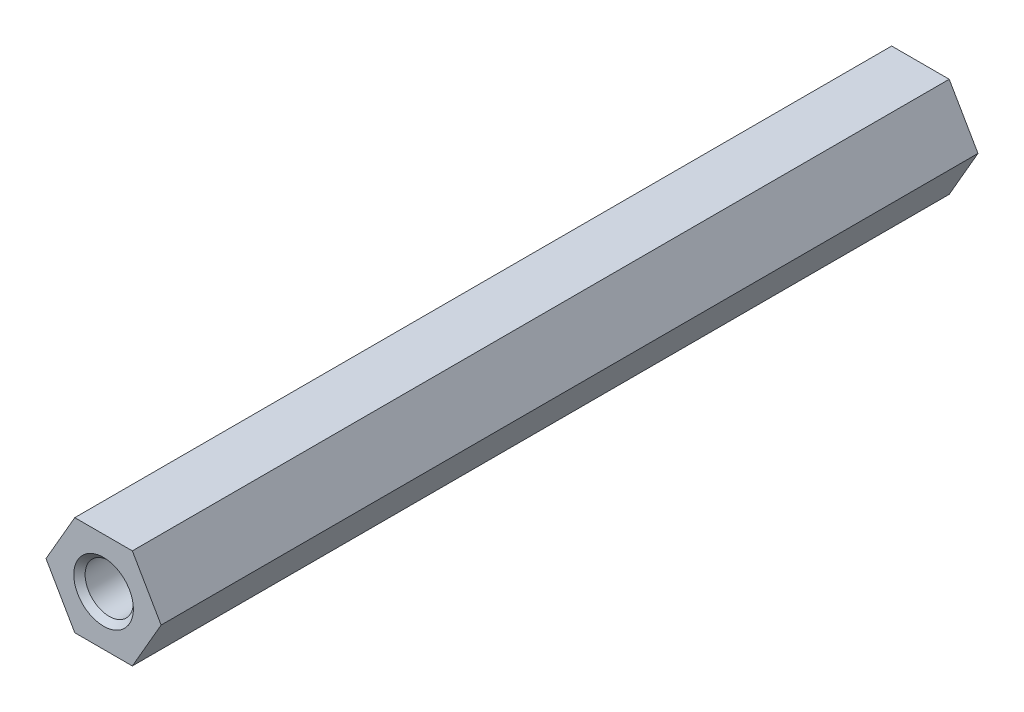
ISO-10303-21;
HEADER;
FILE_DESCRIPTION(('STEP AP214'),'2;1');
FILE_NAME('part.step','',(''),(''),'','','');
FILE_SCHEMA(('AUTOMOTIVE_DESIGN { 1 0 10303 214 1 1 1 1 }'));
ENDSEC;
DATA;
#1=APPLICATION_CONTEXT('core data for automotive mechanical design processes');
#2=APPLICATION_PROTOCOL_DEFINITION('international standard','automotive_design',2000,#1);
#3=PRODUCT_CONTEXT('',#1,'mechanical');
#4=PRODUCT('Part','Part','',(#3));
#5=PRODUCT_RELATED_PRODUCT_CATEGORY('part','',(#4));
#6=PRODUCT_DEFINITION_FORMATION('','',#4);
#7=PRODUCT_DEFINITION_CONTEXT('part definition',#1,'design');
#8=PRODUCT_DEFINITION('design','',#6,#7);
#9=PRODUCT_DEFINITION_SHAPE('','',#8);
#10=(LENGTH_UNIT() NAMED_UNIT(*) SI_UNIT(.MILLI.,.METRE.));
#11=(NAMED_UNIT(*) PLANE_ANGLE_UNIT() SI_UNIT($,.RADIAN.));
#12=(NAMED_UNIT(*) SI_UNIT($,.STERADIAN.) SOLID_ANGLE_UNIT());
#13=UNCERTAINTY_MEASURE_WITH_UNIT(LENGTH_MEASURE(1.E-05),#10,'distance_accuracy_value','');
#14=(GEOMETRIC_REPRESENTATION_CONTEXT(3) GLOBAL_UNCERTAINTY_ASSIGNED_CONTEXT((#13)) GLOBAL_UNIT_ASSIGNED_CONTEXT((#10,
#11,#12)) REPRESENTATION_CONTEXT('',''));
#15=CARTESIAN_POINT('',(0.,0.,0.));
#16=DIRECTION('',(0.,0.,1.));
#17=DIRECTION('',(1.,0.,0.));
#18=AXIS2_PLACEMENT_3D('',#15,#16,#17);
#19=CARTESIAN_POINT('',(1.78978583448784,-3.1,-50.8));
#20=DIRECTION('',(0.866025403784439,-0.5,0.));
#21=DIRECTION('',(0.5,0.866025403784439,0.));
#22=AXIS2_PLACEMENT_3D('',#19,#20,#21);
#23=PLANE('',#22);
#24=DIRECTION('',(0.5,0.866025403784439,0.));
#25=VECTOR('',#24,1.);
#26=CARTESIAN_POINT('',(1.78978583448784,-3.1,0.));
#27=LINE('',#26,#25);
#28=CARTESIAN_POINT('',(1.78978583448784,-3.1,0.));
#29=VERTEX_POINT('',#28);
#30=CARTESIAN_POINT('',(3.57957166897568,0.,0.));
#31=VERTEX_POINT('',#30);
#32=EDGE_CURVE('E125',#29,#31,#27,.T.);
#33=ORIENTED_EDGE('',*,*,#32,.F.);
#34=DIRECTION('',(0.,0.,1.));
#35=VECTOR('',#34,1.);
#36=CARTESIAN_POINT('',(1.78978583448784,-3.1,-50.8));
#37=LINE('',#36,#35);
#38=CARTESIAN_POINT('',(1.78978583448784,-3.1,-50.8));
#39=VERTEX_POINT('',#38);
#40=EDGE_CURVE('E54',#39,#29,#37,.T.);
#41=ORIENTED_EDGE('',*,*,#40,.F.);
#42=DIRECTION('',(0.5,0.866025403784439,0.));
#43=VECTOR('',#42,1.);
#44=CARTESIAN_POINT('',(1.78978583448784,-3.1,-50.8));
#45=LINE('',#44,#43);
#46=CARTESIAN_POINT('',(3.57957166897568,0.,-50.8));
#47=VERTEX_POINT('',#46);
#48=EDGE_CURVE('E141',#39,#47,#45,.T.);
#49=ORIENTED_EDGE('',*,*,#48,.T.);
#50=DIRECTION('',(0.,0.,1.));
#51=VECTOR('',#50,1.);
#52=CARTESIAN_POINT('',(3.57957166897568,0.,-50.8));
#53=LINE('',#52,#51);
#54=EDGE_CURVE('E89',#47,#31,#53,.T.);
#55=ORIENTED_EDGE('',*,*,#54,.T.);
#56=EDGE_LOOP('',(#33,#41,#49,#55));
#57=FACE_BOUND('',#56,.T.);
#58=ADVANCED_FACE('F32',(#57),#23,.T.);
#59=CARTESIAN_POINT('',(-1.78978583448784,-3.1,-50.8));
#60=DIRECTION('',(0.,-1.,0.));
#61=DIRECTION('',(0.,0.,-1.));
#62=AXIS2_PLACEMENT_3D('',#59,#60,#61);
#63=PLANE('',#62);
#64=DIRECTION('',(1.,0.,0.));
#65=VECTOR('',#64,1.);
#66=CARTESIAN_POINT('',(-1.78978583448784,-3.1,0.));
#67=LINE('',#66,#65);
#68=CARTESIAN_POINT('',(-1.78978583448784,-3.1,0.));
#69=VERTEX_POINT('',#68);
#70=EDGE_CURVE('E138',#69,#29,#67,.T.);
#71=ORIENTED_EDGE('',*,*,#70,.F.);
#72=DIRECTION('',(0.,0.,1.));
#73=VECTOR('',#72,1.);
#74=CARTESIAN_POINT('',(-1.78978583448784,-3.1,-50.8));
#75=LINE('',#74,#73);
#76=CARTESIAN_POINT('',(-1.78978583448784,-3.1,-50.8));
#77=VERTEX_POINT('',#76);
#78=EDGE_CURVE('E77',#77,#69,#75,.T.);
#79=ORIENTED_EDGE('',*,*,#78,.F.);
#80=DIRECTION('',(1.,0.,0.));
#81=VECTOR('',#80,1.);
#82=CARTESIAN_POINT('',(-1.78978583448784,-3.1,-50.8));
#83=LINE('',#82,#81);
#84=EDGE_CURVE('E115',#77,#39,#83,.T.);
#85=ORIENTED_EDGE('',*,*,#84,.T.);
#86=ORIENTED_EDGE('',*,*,#40,.T.);
#87=EDGE_LOOP('',(#71,#79,#85,#86));
#88=FACE_BOUND('',#87,.T.);
#89=ADVANCED_FACE('F168',(#88),#63,.T.);
#90=CARTESIAN_POINT('',(-3.57957166897568,0.,-50.8));
#91=DIRECTION('',(-0.866025403784438,-0.5,0.));
#92=DIRECTION('',(0.5,-0.866025403784439,0.));
#93=AXIS2_PLACEMENT_3D('',#90,#91,#92);
#94=PLANE('',#93);
#95=DIRECTION('',(0.5,-0.866025403784438,0.));
#96=VECTOR('',#95,1.);
#97=CARTESIAN_POINT('',(-3.57957166897568,0.,0.));
#98=LINE('',#97,#96);
#99=CARTESIAN_POINT('',(-3.57957166897568,0.,0.));
#100=VERTEX_POINT('',#99);
#101=EDGE_CURVE('E102',#100,#69,#98,.T.);
#102=ORIENTED_EDGE('',*,*,#101,.F.);
#103=DIRECTION('',(0.,0.,1.));
#104=VECTOR('',#103,1.);
#105=CARTESIAN_POINT('',(-3.57957166897568,0.,-50.8));
#106=LINE('',#105,#104);
#107=CARTESIAN_POINT('',(-3.57957166897568,0.,-50.8));
#108=VERTEX_POINT('',#107);
#109=EDGE_CURVE('E97',#108,#100,#106,.T.);
#110=ORIENTED_EDGE('',*,*,#109,.F.);
#111=DIRECTION('',(0.5,-0.866025403784438,0.));
#112=VECTOR('',#111,1.);
#113=CARTESIAN_POINT('',(-3.57957166897568,0.,-50.8));
#114=LINE('',#113,#112);
#115=EDGE_CURVE('E100',#108,#77,#114,.T.);
#116=ORIENTED_EDGE('',*,*,#115,.T.);
#117=ORIENTED_EDGE('',*,*,#78,.T.);
#118=EDGE_LOOP('',(#102,#110,#116,#117));
#119=FACE_BOUND('',#118,.T.);
#120=ADVANCED_FACE('F99',(#119),#94,.T.);
#121=CARTESIAN_POINT('',(-1.78978583448784,3.1,-50.8));
#122=DIRECTION('',(-0.866025403784439,0.5,0.));
#123=DIRECTION('',(-0.5,-0.866025403784439,0.));
#124=AXIS2_PLACEMENT_3D('',#121,#122,#123);
#125=PLANE('',#124);
#126=DIRECTION('',(-0.5,-0.866025403784439,0.));
#127=VECTOR('',#126,1.);
#128=CARTESIAN_POINT('',(-1.78978583448784,3.1,0.));
#129=LINE('',#128,#127);
#130=CARTESIAN_POINT('',(-1.78978583448784,3.1,0.));
#131=VERTEX_POINT('',#130);
#132=EDGE_CURVE('E135',#131,#100,#129,.T.);
#133=ORIENTED_EDGE('',*,*,#132,.F.);
#134=DIRECTION('',(0.,0.,1.));
#135=VECTOR('',#134,1.);
#136=CARTESIAN_POINT('',(-1.78978583448784,3.1,-50.8));
#137=LINE('',#136,#135);
#138=CARTESIAN_POINT('',(-1.78978583448784,3.1,-50.8));
#139=VERTEX_POINT('',#138);
#140=EDGE_CURVE('E107',#139,#131,#137,.T.);
#141=ORIENTED_EDGE('',*,*,#140,.F.);
#142=DIRECTION('',(-0.5,-0.866025403784439,0.));
#143=VECTOR('',#142,1.);
#144=CARTESIAN_POINT('',(-1.78978583448784,3.1,-50.8));
#145=LINE('',#144,#143);
#146=EDGE_CURVE('E113',#139,#108,#145,.T.);
#147=ORIENTED_EDGE('',*,*,#146,.T.);
#148=ORIENTED_EDGE('',*,*,#109,.T.);
#149=EDGE_LOOP('',(#133,#141,#147,#148));
#150=FACE_BOUND('',#149,.T.);
#151=ADVANCED_FACE('F117',(#150),#125,.T.);
#152=CARTESIAN_POINT('',(1.78978583448784,3.1,-50.8));
#153=DIRECTION('',(0.,1.,0.));
#154=DIRECTION('',(-1.,0.,0.));
#155=AXIS2_PLACEMENT_3D('',#152,#153,#154);
#156=PLANE('',#155);
#157=DIRECTION('',(-1.,0.,0.));
#158=VECTOR('',#157,1.);
#159=CARTESIAN_POINT('',(1.78978583448784,3.1,0.));
#160=LINE('',#159,#158);
#161=CARTESIAN_POINT('',(1.78978583448784,3.1,0.));
#162=VERTEX_POINT('',#161);
#163=EDGE_CURVE('E132',#162,#131,#160,.T.);
#164=ORIENTED_EDGE('',*,*,#163,.F.);
#165=DIRECTION('',(0.,0.,1.));
#166=VECTOR('',#165,1.);
#167=CARTESIAN_POINT('',(1.78978583448784,3.1,-50.8));
#168=LINE('',#167,#166);
#169=CARTESIAN_POINT('',(1.78978583448784,3.1,-50.8));
#170=VERTEX_POINT('',#169);
#171=EDGE_CURVE('E145',#170,#162,#168,.T.);
#172=ORIENTED_EDGE('',*,*,#171,.F.);
#173=DIRECTION('',(-1.,0.,0.));
#174=VECTOR('',#173,1.);
#175=CARTESIAN_POINT('',(1.78978583448784,3.1,-50.8));
#176=LINE('',#175,#174);
#177=EDGE_CURVE('E118',#170,#139,#176,.T.);
#178=ORIENTED_EDGE('',*,*,#177,.T.);
#179=ORIENTED_EDGE('',*,*,#140,.T.);
#180=EDGE_LOOP('',(#164,#172,#178,#179));
#181=FACE_BOUND('',#180,.T.);
#182=ADVANCED_FACE('F177',(#181),#156,.T.);
#183=CARTESIAN_POINT('',(3.57957166897568,0.,-50.8));
#184=DIRECTION('',(0.866025403784439,0.5,0.));
#185=DIRECTION('',(-0.5,0.866025403784439,0.));
#186=AXIS2_PLACEMENT_3D('',#183,#184,#185);
#187=PLANE('',#186);
#188=DIRECTION('',(-0.5,0.866025403784439,0.));
#189=VECTOR('',#188,1.);
#190=CARTESIAN_POINT('',(3.57957166897568,0.,0.));
#191=LINE('',#190,#189);
#192=EDGE_CURVE('E128',#31,#162,#191,.T.);
#193=ORIENTED_EDGE('',*,*,#192,.F.);
#194=ORIENTED_EDGE('',*,*,#54,.F.);
#195=DIRECTION('',(-0.5,0.866025403784439,0.));
#196=VECTOR('',#195,1.);
#197=CARTESIAN_POINT('',(3.57957166897568,0.,-50.8));
#198=LINE('',#197,#196);
#199=EDGE_CURVE('E120',#47,#170,#198,.T.);
#200=ORIENTED_EDGE('',*,*,#199,.T.);
#201=ORIENTED_EDGE('',*,*,#171,.T.);
#202=EDGE_LOOP('',(#193,#194,#200,#201));
#203=FACE_BOUND('',#202,.T.);
#204=ADVANCED_FACE('F174',(#203),#187,.T.);
#205=CARTESIAN_POINT('',(0.,-6.2,-50.8));
#206=DIRECTION('',(0.,0.,-1.));
#207=DIRECTION('',(-1.,0.,0.));
#208=AXIS2_PLACEMENT_3D('',#205,#206,#207);
#209=PLANE('',#208);
#210=CARTESIAN_POINT('',(0.000428254180053758,0.000741757998406947,-50.8));
#211=DIRECTION('',(0.,0.,-1.));
#212=DIRECTION('',(-1.,0.,0.));
#213=AXIS2_PLACEMENT_3D('',#210,#211,#212);
#214=CIRCLE('',#213,1.85254999999999);
#215=CARTESIAN_POINT('',(-1.85212174581994,0.000741757998406947,-50.8));
#216=VERTEX_POINT('',#215);
#217=EDGE_CURVE('E11',#216,#216,#214,.F.);
#218=ORIENTED_EDGE('',*,*,#217,.T.);
#219=EDGE_LOOP('',(#218));
#220=FACE_BOUND('',#219,.T.);
#221=ORIENTED_EDGE('',*,*,#48,.F.);
#222=ORIENTED_EDGE('',*,*,#84,.F.);
#223=ORIENTED_EDGE('',*,*,#115,.F.);
#224=ORIENTED_EDGE('',*,*,#146,.F.);
#225=ORIENTED_EDGE('',*,*,#177,.F.);
#226=ORIENTED_EDGE('',*,*,#199,.F.);
#227=EDGE_LOOP('',(#221,#222,#223,#224,#225,#226));
#228=FACE_BOUND('',#227,.T.);
#229=ADVANCED_FACE('F111',(#220,#228),#209,.T.);
#230=CARTESIAN_POINT('',(0.,-6.2,0.));
#231=DIRECTION('',(0.,0.,-1.));
#232=DIRECTION('',(-1.,0.,0.));
#233=AXIS2_PLACEMENT_3D('',#230,#231,#232);
#234=PLANE('',#233);
#235=CARTESIAN_POINT('',(0.000428254180053758,0.000741757998406947,0.));
#236=DIRECTION('',(0.,0.,-1.));
#237=DIRECTION('',(-1.,0.,0.));
#238=AXIS2_PLACEMENT_3D('',#235,#236,#237);
#239=CIRCLE('',#238,1.85254999999998);
#240=CARTESIAN_POINT('',(-1.85212174581993,0.000741757998406947,0.));
#241=VERTEX_POINT('',#240);
#242=EDGE_CURVE('E46',#241,#241,#239,.T.);
#243=ORIENTED_EDGE('',*,*,#242,.T.);
#244=EDGE_LOOP('',(#243));
#245=FACE_BOUND('',#244,.T.);
#246=ORIENTED_EDGE('',*,*,#32,.T.);
#247=ORIENTED_EDGE('',*,*,#192,.T.);
#248=ORIENTED_EDGE('',*,*,#163,.T.);
#249=ORIENTED_EDGE('',*,*,#132,.T.);
#250=ORIENTED_EDGE('',*,*,#101,.T.);
#251=ORIENTED_EDGE('',*,*,#70,.T.);
#252=EDGE_LOOP('',(#246,#247,#248,#249,#250,#251));
#253=FACE_BOUND('',#252,.T.);
#254=ADVANCED_FACE('F151',(#245,#253),#234,.F.);
#255=CARTESIAN_POINT('',(0.000428254180053758,0.000741757998406947,-0.499999999999989));
#256=DIRECTION('',(0.,0.,1.));
#257=DIRECTION('',(1.,0.,0.));
#258=AXIS2_PLACEMENT_3D('',#255,#256,#257);
#259=CONICAL_SURFACE('',#258,1.35254999999999,0.78539816339745);
#260=CARTESIAN_POINT('',(-1.13887388692376,-0.976199913219537,-0.351742085431551));
#261=CARTESIAN_POINT('',(-1.09050740140774,-1.03262422726677,-0.351727999669262));
#262=CARTESIAN_POINT('',(-1.03792822463204,-1.0854607292848,-0.351716889317182));
#263=CARTESIAN_POINT('',(-0.925496150422692,-1.18279074114641,-0.351700867690997));
#264=CARTESIAN_POINT('',(-0.865637840334296,-1.22727797931283,-0.351695961061167));
#265=CARTESIAN_POINT('',(-0.73156878000186,-1.31221566223573,-0.351692238157879));
#266=CARTESIAN_POINT('',(-0.656508760453995,-1.35133460901226,-0.351694322265547));
#267=CARTESIAN_POINT('',(-0.500879254625431,-1.41641772536883,-0.351706564036563));
#268=CARTESIAN_POINT('',(-0.420308546692796,-1.44237896724928,-0.351716723495455));
#269=CARTESIAN_POINT('',(-0.255956494491913,-1.48040491021355,-0.351744827086582));
#270=CARTESIAN_POINT('',(-0.172175426279043,-1.49247080338486,-0.351762770550843));
#271=CARTESIAN_POINT('',(-0.00378173055184395,-1.50236459758979,-0.351805932855938));
#272=CARTESIAN_POINT('',(0.0808308545064723,-1.50019322182451,-0.351831151327166));
#273=CARTESIAN_POINT('',(0.248492519458984,-1.48167634530228,-0.351888149663282));
#274=CARTESIAN_POINT('',(0.331541567071425,-1.4653305522188,-0.351919929663481));
#275=CARTESIAN_POINT('',(0.493717441644787,-1.41892802990144,-0.351989150145478));
#276=CARTESIAN_POINT('',(0.572844230465483,-1.38887116736948,-0.352026590682304));
#277=CARTESIAN_POINT('',(0.724928268785867,-1.31589990246012,-0.352106070152555));
#278=CARTESIAN_POINT('',(0.797885543430412,-1.27298555248874,-0.352148109067237));
#279=CARTESIAN_POINT('',(0.935559768895114,-1.17551753086171,-0.352235593011925));
#280=CARTESIAN_POINT('',(1.00027673016371,-1.12096387396452,-0.352281038037613));
#281=CARTESIAN_POINT('',(1.11963336895297,-1.00176577713641,-0.352374044992566));
#282=CARTESIAN_POINT('',(1.17427303828985,-0.937121329010814,-0.352421606923549));
#283=CARTESIAN_POINT('',(1.27192396520623,-0.799576750704476,-0.352517497920261));
#284=CARTESIAN_POINT('',(1.31493522343341,-0.726676620983566,-0.352565826985947));
#285=CARTESIAN_POINT('',(1.38810837158268,-0.574690092684228,-0.352661880360964));
#286=CARTESIAN_POINT('',(1.41827026084106,-0.495603693786263,-0.352709604670262));
#287=CARTESIAN_POINT('',(1.4648884629052,-0.33348965058808,-0.352803093415658));
#288=CARTESIAN_POINT('',(1.48134477407432,-0.250462005817219,-0.352848857851521));
#289=CARTESIAN_POINT('',(1.5000846663324,-0.0828223950719922,-0.352937127006785));
#290=CARTESIAN_POINT('',(1.50236824815492,0.00178957082037227,-0.352979631726354));
#291=CARTESIAN_POINT('',(1.4926978587608,0.170195937885083,-0.35306017387933));
#292=CARTESIAN_POINT('',(1.48074388833707,0.253990339102961,-0.353098211312986));
#293=CARTESIAN_POINT('',(1.44293773457422,0.418382896422403,-0.353168737978714));
#294=CARTESIAN_POINT('',(1.41708555253506,0.498981052822924,-0.353201227211305));
#295=CARTESIAN_POINT('',(1.35221684240028,0.654693184301824,-0.353259734033128));
#296=CARTESIAN_POINT('',(1.313200314128,0.729807159306607,-0.353285751622272));
#297=CARTESIAN_POINT('',(1.22311048353422,0.872418648019586,-0.35333057552054));
#298=CARTESIAN_POINT('',(1.17203718330923,0.939916163052179,-0.353349381830918));
#299=CARTESIAN_POINT('',(1.05928362468927,1.06537869102613,-0.353379248477601));
#300=CARTESIAN_POINT('',(0.997603366125521,1.1233437038158,-0.353390308813784));
#301=CARTESIAN_POINT('',(0.865386819602973,1.22809576337856,-0.353404369015283));
#302=CARTESIAN_POINT('',(0.794850532546577,1.27488281129065,-0.353407368881421));
#303=CARTESIAN_POINT('',(0.646924248104241,1.35595079840026,-0.353405222841876));
#304=CARTESIAN_POINT('',(0.569534251266561,1.39023173859822,-0.353400076936844));
#305=CARTESIAN_POINT('',(0.410097428054318,1.44531437685661,-0.353381785684094));
#306=CARTESIAN_POINT('',(0.328050602318355,1.46611607676549,-0.353368640337471));
#307=CARTESIAN_POINT('',(0.161629157938013,1.49364974714614,-0.353334723972634));
#308=CARTESIAN_POINT('',(0.0772545387011656,1.50038171403687,-0.353313952952478));
#309=CARTESIAN_POINT('',(-0.0914273470598226,1.49958480769353,-0.353265375777363));
#310=CARTESIAN_POINT('',(-0.17573461356643,1.49205593074815,-0.353237569620573));
#311=CARTESIAN_POINT('',(-0.341888480051729,1.46295106297507,-0.353175712639659));
#312=CARTESIAN_POINT('',(-0.423735081661357,1.44137508145805,-0.353141661819673));
#313=CARTESIAN_POINT('',(-0.582644287786972,1.38478849568124,-0.353068283283234));
#314=CARTESIAN_POINT('',(-0.659706892753876,1.34977789268774,-0.353028955567277));
#315=CARTESIAN_POINT('',(-0.806860619524566,1.26731586412141,-0.352946140700033));
#316=CARTESIAN_POINT('',(-0.876951733477018,1.21986442453787,-0.352902653544061));
#317=CARTESIAN_POINT('',(-1.00817262927218,1.11386780881056,-0.352812755280825));
#318=CARTESIAN_POINT('',(-1.06930242064125,1.05532264446015,-0.352766344176668));
#319=CARTESIAN_POINT('',(-1.180865535778,0.928800377911195,-0.352671916014574));
#320=CARTESIAN_POINT('',(-1.23129884546019,0.860823263292521,-0.352623898954523));
#321=CARTESIAN_POINT('',(-1.32003779399831,0.717366000439248,-0.352527621702651));
#322=CARTESIAN_POINT('',(-1.35834328824553,0.641885762753588,-0.352479361507938));
#323=CARTESIAN_POINT('',(-1.4217375009889,0.485567475894627,-0.352383969582149));
#324=CARTESIAN_POINT('',(-1.44682654912892,0.404729560408849,-0.352336837822957));
#325=CARTESIAN_POINT('',(-1.48307624940783,0.239994869964762,-0.352245042102271));
#326=CARTESIAN_POINT('',(-1.49423782338471,0.156098297832554,-0.352200377977635));
#327=CARTESIAN_POINT('',(-1.50231831113283,-0.0123925825913282,-0.352114773731298));
#328=CARTESIAN_POINT('',(-1.49923498333521,-0.0969869986044824,-0.352073834196729));
#329=CARTESIAN_POINT('',(-1.47890928799384,-0.264477662528767,-0.351996838626896));
#330=CARTESIAN_POINT('',(-1.46166264942481,-0.347373390461412,-0.351960784068545));
#331=CARTESIAN_POINT('',(-1.41349697599861,-0.509047733443741,-0.351894614134923));
#332=CARTESIAN_POINT('',(-1.38258835064896,-0.587829432102291,-0.351864494263037));
#333=CARTESIAN_POINT('',(-1.31760764215494,-0.71961259030189,-0.351817901062881));
#334=CARTESIAN_POINT('',(-1.28638459338841,-0.774040329884582,-0.351799909436793));
#335=CARTESIAN_POINT('',(-1.21739475908469,-0.878560334351302,-0.351767936918241));
#336=CARTESIAN_POINT('',(-1.17962995642849,-0.928653906092273,-0.351753954813847));
#337=CARTESIAN_POINT('',(-1.13887388692376,-0.976199913219537,-0.351742085431551));
#338=B_SPLINE_CURVE_WITH_KNOTS('',3,(#260,#261,#262,#263,#264,#265,#266,#267,#268,#269,#270,
#271,#272,#273,#274,#275,#276,#277,#278,#279,#280,#281,#282,#283,#284,#285,#286,#287,#288,#289,
#290,#291,#292,#293,#294,#295,#296,#297,#298,#299,#300,#301,#302,#303,#304,#305,#306,#307,#308,
#309,#310,#311,#312,#313,#314,#315,#316,#317,#318,#319,#320,#321,#322,#323,#324,#325,#326,#327,
#328,#329,#330,#331,#332,#333,#334,#335,#336,#337),.UNSPECIFIED.,.T.,.F.,(4,2,2,2,2,2,2,2,2,2,2,
2,2,2,2,2,2,2,2,2,2,2,2,2,2,2,2,2,2,2,2,2,2,2,2,2,2,2,4),(0.,0.2227734525108,0.445713580742492,
0.698412340925673,0.951167304041935,1.20390058159383,1.45662102132064,1.70934667315921,
1.96207478203179,2.21480186082031,2.46752861915628,2.72025558273124,2.97298253222971,
3.22570949478218,3.47843648751402,3.7311634671652,3.98389043274164,4.23661737467948,
4.48934432000877,4.7420712213923,4.99479812679726,5.2475250064501,5.50025186588612,
5.75297869066524,6.00570557976867,6.25843253464302,6.51115932200541,6.76388608554687,
7.01661313370747,7.26933991320403,7.52206702549771,7.77479715112597,8.0275209728751,
8.28022806633774,8.53297492698536,8.7857980328562,9.03842883583405,9.22620593624596,
9.4139262185338),.UNSPECIFIED.);
#339=CARTESIAN_POINT('',(-1.13887388692376,-0.976199913219537,-0.351742085431551));
#340=VERTEX_POINT('',#339);
#341=EDGE_CURVE('E129',#340,#340,#338,.T.);
#342=ORIENTED_EDGE('',*,*,#341,.F.);
#343=EDGE_LOOP('',(#342));
#344=FACE_BOUND('',#343,.T.);
#345=ORIENTED_EDGE('',*,*,#242,.F.);
#346=EDGE_LOOP('',(#345));
#347=FACE_BOUND('',#346,.T.);
#348=ADVANCED_FACE('F154',(#344,#347),#259,.F.);
#349=CARTESIAN_POINT('',(0.000428254180053758,0.000741757998406947,-50.8));
#350=DIRECTION('',(0.,0.,-1.));
#351=DIRECTION('',(-1.,0.,0.));
#352=AXIS2_PLACEMENT_3D('',#349,#350,#351);
#353=CONICAL_SURFACE('',#352,1.85254999999999,0.785398163397453);
#354=CARTESIAN_POINT('',(-1.13887388692376,-0.976199913219536,-50.4482579145684));
#355=CARTESIAN_POINT('',(-1.18723843178747,-0.919773935983853,-50.4482438274122));
#356=CARTESIAN_POINT('',(-1.23141316110035,-0.859733459049708,-50.448226758183));
#357=CARTESIAN_POINT('',(-1.31040546193357,-0.733740135733206,-50.4481870264537));
#358=CARTESIAN_POINT('',(-1.34521600783267,-0.667782899409288,-50.4481643597784));
#359=CARTESIAN_POINT('',(-1.40865302819891,-0.522302087482466,-50.448110554884));
#360=CARTESIAN_POINT('',(-1.43583379444896,-0.442142842046596,-50.4480786897268));
#361=CARTESIAN_POINT('',(-1.47635276464908,-0.278391297970539,-50.4480093094729));
#362=CARTESIAN_POINT('',(-1.48968788851056,-0.194798239745311,-50.4479717931212));
#363=CARTESIAN_POINT('',(-1.50213407068702,-0.0265642790959227,-50.4478921795286));
#364=CARTESIAN_POINT('',(-1.50124634707775,0.0580765329759352,-50.4478500826802));
#365=CARTESIAN_POINT('',(-1.48527319944985,0.22600267812474,-50.4477625027296));
#366=CARTESIAN_POINT('',(-1.47018849661105,0.309288079835367,-50.4477170197994));
#367=CARTESIAN_POINT('',(-1.42625075541226,0.472146280386605,-50.4476239548819));
#368=CARTESIAN_POINT('',(-1.39739743222079,0.551719002385616,-50.4475763728514));
#369=CARTESIAN_POINT('',(-1.32674088286473,0.704891693209697,-50.447480460511));
#370=CARTESIAN_POINT('',(-1.28493753080432,0.77849160396033,-50.447432130194));
#371=CARTESIAN_POINT('',(-1.18956794341912,0.917628279196066,-50.4473360938651));
#372=CARTESIAN_POINT('',(-1.13600175683665,0.983165077090997,-50.4472883878506));
#373=CARTESIAN_POINT('',(-1.01862705104427,1.10431538994328,-50.4471949545936));
#374=CARTESIAN_POINT('',(-0.954818544829903,1.15992891749118,-50.4471492273486));
#375=CARTESIAN_POINT('',(-0.8187704436408,1.25965412509601,-50.4470610503185));
#376=CARTESIAN_POINT('',(-0.746530843252084,1.30376579776703,-50.4470186005355));
#377=CARTESIAN_POINT('',(-0.595671260022293,1.37923504344898,-50.4469381844782));
#378=CARTESIAN_POINT('',(-0.51705127754362,1.41059261718434,-50.4469002182037));
#379=CARTESIAN_POINT('',(-0.355662728884892,1.45966351476338,-50.4468298480618));
#380=CARTESIAN_POINT('',(-0.272894163310763,1.47737684059989,-50.4467974441937));
#381=CARTESIAN_POINT('',(-0.105557984089297,1.49865642066053,-50.4467391198771));
#382=CARTESIAN_POINT('',(-0.0209903702287551,1.50222267320809,-50.4467131994293));
#383=CARTESIAN_POINT('',(0.147543252721495,1.49510686622076,-50.4466685788351));
#384=CARTESIAN_POINT('',(0.231509261925835,1.48442480940085,-50.4466498786872));
#385=CARTESIAN_POINT('',(0.396456138406238,1.44911562086183,-50.4466202303695));
#386=CARTESIAN_POINT('',(0.477437005849469,1.42448848992365,-50.4466092821994));
#387=CARTESIAN_POINT('',(0.634114785396172,1.36198824878755,-50.4465954491429));
#388=CARTESIAN_POINT('',(0.709811698093772,1.324115140079,-50.4465925642555));
#389=CARTESIAN_POINT('',(0.853772766143871,1.23619804841858,-50.446594939796));
#390=CARTESIAN_POINT('',(0.922036921393488,1.18615406529824,-50.4466002002239));
#391=CARTESIAN_POINT('',(1.0491946504793,1.07531583059955,-50.4466187168112));
#392=CARTESIAN_POINT('',(1.10808822491993,1.01452157971464,-50.4466319729702));
#393=CARTESIAN_POINT('',(1.21483298378867,0.883908576528084,-50.4466661040945));
#394=CARTESIAN_POINT('',(1.26268416803037,0.814089824074102,-50.44668697906));
#395=CARTESIAN_POINT('',(1.34598579543125,0.667409761390972,-50.4467357543027));
#396=CARTESIAN_POINT('',(1.38143623750136,0.590548450543332,-50.4467636545806));
#397=CARTESIAN_POINT('',(1.43893003975361,0.431965149426326,-50.4468256873272));
#398=CARTESIAN_POINT('',(1.46097340099363,0.350243159540493,-50.4468598197955));
#399=CARTESIAN_POINT('',(1.49102730195576,0.184258336983456,-50.4469333468284));
#400=CARTESIAN_POINT('',(1.49903784098119,0.0999955041861098,-50.4469727413932));
#401=CARTESIAN_POINT('',(1.50079870117062,-0.0686790489165797,-50.4470556732211));
#402=CARTESIAN_POINT('',(1.49454901869464,-0.153090769259921,-50.4470992104851));
#403=CARTESIAN_POINT('',(1.46796683448621,-0.319666906142763,-50.4471891909034));
#404=CARTESIAN_POINT('',(1.44763432765443,-0.40183132186851,-50.4472356340587));
#405=CARTESIAN_POINT('',(1.39346368833675,-0.561580357285832,-50.4473301072025));
#406=CARTESIAN_POINT('',(1.35962556480191,-0.639164980012696,-50.4473781371899));
#407=CARTESIAN_POINT('',(1.27940426137804,-0.787552082523755,-50.4474744203315));
#408=CARTESIAN_POINT('',(1.23302108301913,-0.858354563135167,-50.4475226734858));
#409=CARTESIAN_POINT('',(1.12902628898124,-0.991167594727821,-50.4476180333909));
#410=CARTESIAN_POINT('',(1.07141466066419,-1.05317813581324,-50.4476651401404));
#411=CARTESIAN_POINT('',(0.946598504097642,-1.16664682729712,-50.4477568704136));
#412=CARTESIAN_POINT('',(0.879393987437105,-1.21810499044349,-50.4478014939403));
#413=CARTESIAN_POINT('',(0.737299636982405,-1.30900832810028,-50.4478869919887));
#414=CARTESIAN_POINT('',(0.662409793076331,-1.3484534868044,-50.4479278665055));
#415=CARTESIAN_POINT('',(0.507069880533101,-1.4142114029381,-50.4480047076774));
#416=CARTESIAN_POINT('',(0.426619746714534,-1.4405240063894,-50.4480406742748));
#417=CARTESIAN_POINT('',(0.262445777921176,-1.47926857233383,-50.4481066783533));
#418=CARTESIAN_POINT('',(0.17872202465609,-1.49170088105118,-50.4481367159821));
#419=CARTESIAN_POINT('',(0.0103815654966603,-1.50233315886645,-50.4481900100269));
#420=CARTESIAN_POINT('',(-0.0742350807752674,-1.50053407232657,-50.4482132668926));
#421=CARTESIAN_POINT('',(-0.241979929143891,-1.48275405780929,-50.4482523458092));
#422=CARTESIAN_POINT('',(-0.325107894917352,-1.46677089816226,-50.4482681666894));
#423=CARTESIAN_POINT('',(-0.48752043938656,-1.42107175551264,-50.4482919243096));
#424=CARTESIAN_POINT('',(-0.566803851328524,-1.39135163205025,-50.4482998586703));
#425=CARTESIAN_POINT('',(-0.719211216577299,-1.31902938512337,-50.4483076032475));
#426=CARTESIAN_POINT('',(-0.792339809034895,-1.27643707718621,-50.448307419639));
#427=CARTESIAN_POINT('',(-0.91263621174511,-1.19206850516623,-50.4483000481002));
#428=CARTESIAN_POINT('',(-0.961649198575795,-1.15288966093712,-50.4482946703736));
#429=CARTESIAN_POINT('',(-1.05439002988194,-1.06872817987687,-50.4482795382214));
#430=CARTESIAN_POINT('',(-1.09811946906173,-1.02374730275907,-50.4482697851206));
#431=CARTESIAN_POINT('',(-1.13887388692376,-0.976199913219536,-50.4482579145684));
#432=B_SPLINE_CURVE_WITH_KNOTS('',3,(#354,#355,#356,#357,#358,#359,#360,#361,#362,#363,#364,
#365,#366,#367,#368,#369,#370,#371,#372,#373,#374,#375,#376,#377,#378,#379,#380,#381,#382,#383,
#384,#385,#386,#387,#388,#389,#390,#391,#392,#393,#394,#395,#396,#397,#398,#399,#400,#401,#402,
#403,#404,#405,#406,#407,#408,#409,#410,#411,#412,#413,#414,#415,#416,#417,#418,#419,#420,#421,
#422,#423,#424,#425,#426,#427,#428,#429,#430,#431),.UNSPECIFIED.,.T.,.F.,(4,2,2,2,2,2,2,2,2,2,2,
2,2,2,2,2,2,2,2,2,2,2,2,2,2,2,2,2,2,2,2,2,2,2,2,2,2,2,4),(0.,0.222773451981118,
0.445713579906043,0.698412360877965,0.951167344946568,1.20390068264132,1.45662118265081,
1.70934691091662,1.96207509617389,2.21480223420665,2.46752905157951,2.72025603124041,
2.97298299654659,3.22570992494055,3.47843688328525,3.73116379347354,3.983890689509,
4.23661755712774,4.48934442824465,4.7420712830595,4.99479814214059,5.24752502341672,
5.50025188475143,5.75297875863304,6.00570569702408,6.25843272692679,6.51115958933104,
6.76388642091012,7.01661353694507,7.26934034766829,7.5220674909192,7.77479759730816,
8.02752139956291,8.28022843179587,8.53297523106944,8.78579826051144,9.03842898718984,
9.22620601176886,9.41392621830014),.UNSPECIFIED.);
#433=CARTESIAN_POINT('',(-1.13887388692376,-0.976199913219536,-50.4482579145684));
#434=VERTEX_POINT('',#433);
#435=EDGE_CURVE('E37',#434,#434,#432,.T.);
#436=ORIENTED_EDGE('',*,*,#435,.F.);
#437=EDGE_LOOP('',(#436));
#438=FACE_BOUND('',#437,.T.);
#439=ORIENTED_EDGE('',*,*,#217,.F.);
#440=EDGE_LOOP('',(#439));
#441=FACE_BOUND('',#440,.T.);
#442=ADVANCED_FACE('F34',(#438,#441),#353,.F.);
#443=CARTESIAN_POINT('',(0.,0.,-50.8));
#444=DIRECTION('',(0.,0.,1.));
#445=DIRECTION('',(1.,0.,0.));
#446=AXIS2_PLACEMENT_3D('',#443,#444,#445);
#447=CYLINDRICAL_SURFACE('',#446,1.5);
#448=ORIENTED_EDGE('',*,*,#341,.T.);
#449=EDGE_LOOP('',(#448));
#450=FACE_BOUND('',#449,.T.);
#451=ORIENTED_EDGE('',*,*,#435,.T.);
#452=EDGE_LOOP('',(#451));
#453=FACE_BOUND('',#452,.T.);
#454=ADVANCED_FACE('F161',(#450,#453),#447,.F.);
#455=CLOSED_SHELL('',(#58,#89,#120,#151,#182,#204,#229,#254,#348,#442,#454));
#456=MANIFOLD_SOLID_BREP('B2',#455);
#457=ADVANCED_BREP_SHAPE_REPRESENTATION('',(#18,#456),#14);
#458=SHAPE_DEFINITION_REPRESENTATION(#9,#457);
ENDSEC;
END-ISO-10303-21;
